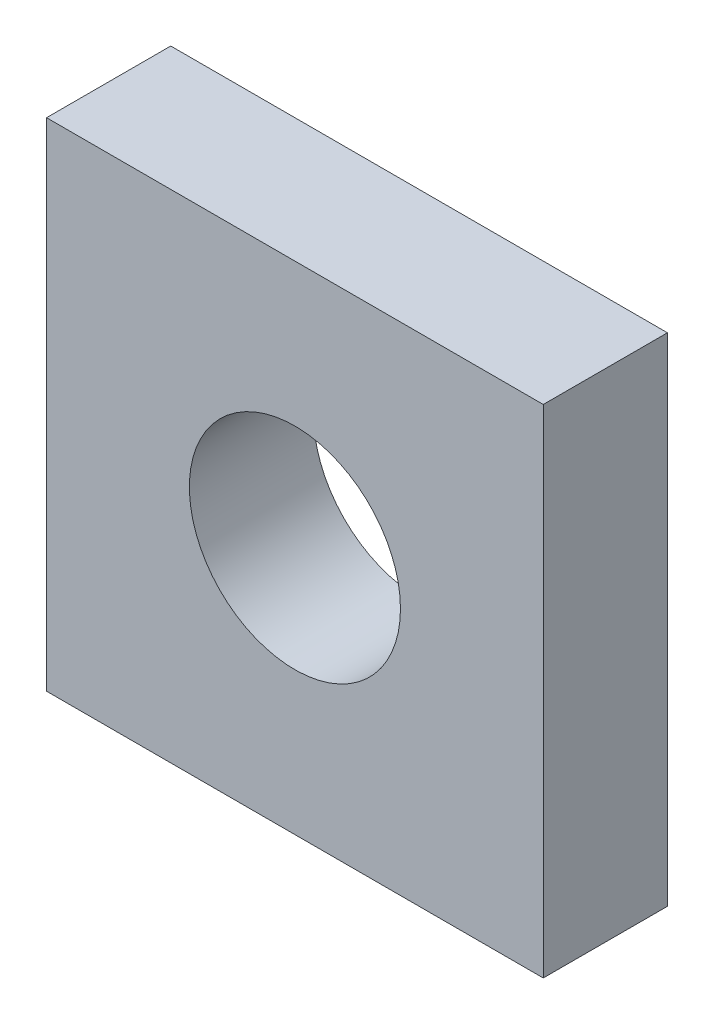
ISO-10303-21;
HEADER;
FILE_DESCRIPTION(('STEP AP214'),'2;1');
FILE_NAME('part.step','',(''),(''),'','','');
FILE_SCHEMA(('AUTOMOTIVE_DESIGN { 1 0 10303 214 1 1 1 1 }'));
ENDSEC;
DATA;
#1=APPLICATION_CONTEXT('core data for automotive mechanical design processes');
#2=APPLICATION_PROTOCOL_DEFINITION('international standard','automotive_design',2000,#1);
#3=PRODUCT_CONTEXT('',#1,'mechanical');
#4=PRODUCT('Part','Part','',(#3));
#5=PRODUCT_RELATED_PRODUCT_CATEGORY('part','',(#4));
#6=PRODUCT_DEFINITION_FORMATION('','',#4);
#7=PRODUCT_DEFINITION_CONTEXT('part definition',#1,'design');
#8=PRODUCT_DEFINITION('design','',#6,#7);
#9=PRODUCT_DEFINITION_SHAPE('','',#8);
#10=(LENGTH_UNIT() NAMED_UNIT(*) SI_UNIT(.MILLI.,.METRE.));
#11=(NAMED_UNIT(*) PLANE_ANGLE_UNIT() SI_UNIT($,.RADIAN.));
#12=(NAMED_UNIT(*) SI_UNIT($,.STERADIAN.) SOLID_ANGLE_UNIT());
#13=UNCERTAINTY_MEASURE_WITH_UNIT(LENGTH_MEASURE(1.E-05),#10,'distance_accuracy_value','');
#14=(GEOMETRIC_REPRESENTATION_CONTEXT(3) GLOBAL_UNCERTAINTY_ASSIGNED_CONTEXT((#13)) GLOBAL_UNIT_ASSIGNED_CONTEXT((#10,
#11,#12)) REPRESENTATION_CONTEXT('',''));
#15=CARTESIAN_POINT('',(0.,0.,0.));
#16=DIRECTION('',(0.,0.,1.));
#17=DIRECTION('',(1.,0.,0.));
#18=AXIS2_PLACEMENT_3D('',#15,#16,#17);
#19=CARTESIAN_POINT('',(78.,-164.,187.4));
#20=DIRECTION('',(0.,0.,1.));
#21=DIRECTION('',(1.,0.,0.));
#22=AXIS2_PLACEMENT_3D('',#19,#20,#21);
#23=CYLINDRICAL_SURFACE('',#22,1.7);
#24=DIRECTION('',(0.,0.,1.));
#25=VECTOR('',#24,1.);
#26=CARTESIAN_POINT('',(79.7,-164.,187.4));
#27=LINE('',#26,#25);
#28=CARTESIAN_POINT('',(79.7,-164.,187.5));
#29=VERTEX_POINT('',#28);
#30=CARTESIAN_POINT('',(79.7,-164.,189.5));
#31=VERTEX_POINT('',#30);
#32=EDGE_CURVE('E9',#29,#31,#27,.T.);
#33=ORIENTED_EDGE('',*,*,#32,.F.);
#34=CARTESIAN_POINT('',(78.,-164.,187.5));
#35=DIRECTION('',(0.,0.,1.));
#36=DIRECTION('',(1.,0.,0.));
#37=AXIS2_PLACEMENT_3D('',#34,#35,#36);
#38=CIRCLE('',#37,1.7);
#39=EDGE_CURVE('E25',#29,#29,#38,.T.);
#40=ORIENTED_EDGE('',*,*,#39,.F.);
#41=ORIENTED_EDGE('',*,*,#32,.T.);
#42=CARTESIAN_POINT('',(78.,-164.,189.5));
#43=DIRECTION('',(0.,0.,1.));
#44=DIRECTION('',(1.,0.,0.));
#45=AXIS2_PLACEMENT_3D('',#42,#43,#44);
#46=CIRCLE('',#45,1.7);
#47=EDGE_CURVE('E104',#31,#31,#46,.T.);
#48=ORIENTED_EDGE('',*,*,#47,.T.);
#49=EDGE_LOOP('',(#33,#40,#41,#48));
#50=FACE_BOUND('',#49,.T.);
#51=ADVANCED_FACE('F14',(#50),#23,.F.);
#52=CARTESIAN_POINT('',(82.,-168.,187.5));
#53=DIRECTION('',(1.,0.,0.));
#54=DIRECTION('',(0.,1.,0.));
#55=AXIS2_PLACEMENT_3D('',#52,#53,#54);
#56=PLANE('',#55);
#57=DIRECTION('',(0.,0.,1.));
#58=VECTOR('',#57,1.);
#59=CARTESIAN_POINT('',(82.,-168.,187.5));
#60=LINE('',#59,#58);
#61=CARTESIAN_POINT('',(82.,-168.,187.5));
#62=VERTEX_POINT('',#61);
#63=CARTESIAN_POINT('',(82.,-168.,189.5));
#64=VERTEX_POINT('',#63);
#65=EDGE_CURVE('E121',#62,#64,#60,.T.);
#66=ORIENTED_EDGE('',*,*,#65,.F.);
#67=DIRECTION('',(0.,1.,0.));
#68=VECTOR('',#67,1.);
#69=CARTESIAN_POINT('',(82.,-168.,187.5));
#70=LINE('',#69,#68);
#71=CARTESIAN_POINT('',(82.,-160.,187.5));
#72=VERTEX_POINT('',#71);
#73=EDGE_CURVE('E96',#62,#72,#70,.T.);
#74=ORIENTED_EDGE('',*,*,#73,.T.);
#75=DIRECTION('',(0.,0.,1.));
#76=VECTOR('',#75,1.);
#77=CARTESIAN_POINT('',(82.,-160.,187.5));
#78=LINE('',#77,#76);
#79=CARTESIAN_POINT('',(82.,-160.,189.5));
#80=VERTEX_POINT('',#79);
#81=EDGE_CURVE('E94',#72,#80,#78,.T.);
#82=ORIENTED_EDGE('',*,*,#81,.T.);
#83=DIRECTION('',(0.,1.,0.));
#84=VECTOR('',#83,1.);
#85=CARTESIAN_POINT('',(82.,-168.,189.5));
#86=LINE('',#85,#84);
#87=EDGE_CURVE('E91',#64,#80,#86,.T.);
#88=ORIENTED_EDGE('',*,*,#87,.F.);
#89=EDGE_LOOP('',(#66,#74,#82,#88));
#90=FACE_BOUND('',#89,.T.);
#91=ADVANCED_FACE('F95',(#90),#56,.T.);
#92=CARTESIAN_POINT('',(74.,-168.,187.5));
#93=DIRECTION('',(0.,0.,1.));
#94=DIRECTION('',(1.,0.,0.));
#95=AXIS2_PLACEMENT_3D('',#92,#93,#94);
#96=PLANE('',#95);
#97=ORIENTED_EDGE('',*,*,#39,.T.);
#98=EDGE_LOOP('',(#97));
#99=FACE_BOUND('',#98,.T.);
#100=DIRECTION('',(1.,0.,0.));
#101=VECTOR('',#100,1.);
#102=CARTESIAN_POINT('',(74.,-160.,187.5));
#103=LINE('',#102,#101);
#104=CARTESIAN_POINT('',(74.,-160.,187.5));
#105=VERTEX_POINT('',#104);
#106=EDGE_CURVE('E74',#105,#72,#103,.T.);
#107=ORIENTED_EDGE('',*,*,#106,.T.);
#108=ORIENTED_EDGE('',*,*,#73,.F.);
#109=DIRECTION('',(1.,0.,0.));
#110=VECTOR('',#109,1.);
#111=CARTESIAN_POINT('',(74.,-168.,187.5));
#112=LINE('',#111,#110);
#113=CARTESIAN_POINT('',(74.,-168.,187.5));
#114=VERTEX_POINT('',#113);
#115=EDGE_CURVE('E84',#114,#62,#112,.T.);
#116=ORIENTED_EDGE('',*,*,#115,.F.);
#117=DIRECTION('',(0.,1.,0.));
#118=VECTOR('',#117,1.);
#119=CARTESIAN_POINT('',(74.,-168.,187.5));
#120=LINE('',#119,#118);
#121=EDGE_CURVE('E116',#114,#105,#120,.T.);
#122=ORIENTED_EDGE('',*,*,#121,.T.);
#123=EDGE_LOOP('',(#107,#108,#116,#122));
#124=FACE_BOUND('',#123,.T.);
#125=ADVANCED_FACE('F141',(#99,#124),#96,.F.);
#126=CARTESIAN_POINT('',(74.,-160.,187.5));
#127=DIRECTION('',(0.,1.,0.));
#128=DIRECTION('',(1.,0.,0.));
#129=AXIS2_PLACEMENT_3D('',#126,#127,#128);
#130=PLANE('',#129);
#131=ORIENTED_EDGE('',*,*,#106,.F.);
#132=DIRECTION('',(0.,0.,1.));
#133=VECTOR('',#132,1.);
#134=CARTESIAN_POINT('',(74.,-160.,187.5));
#135=LINE('',#134,#133);
#136=CARTESIAN_POINT('',(74.,-160.,189.5));
#137=VERTEX_POINT('',#136);
#138=EDGE_CURVE('E101',#105,#137,#135,.T.);
#139=ORIENTED_EDGE('',*,*,#138,.T.);
#140=DIRECTION('',(1.,0.,0.));
#141=VECTOR('',#140,1.);
#142=CARTESIAN_POINT('',(74.,-160.,189.5));
#143=LINE('',#142,#141);
#144=EDGE_CURVE('E66',#137,#80,#143,.T.);
#145=ORIENTED_EDGE('',*,*,#144,.T.);
#146=ORIENTED_EDGE('',*,*,#81,.F.);
#147=EDGE_LOOP('',(#131,#139,#145,#146));
#148=FACE_BOUND('',#147,.T.);
#149=ADVANCED_FACE('F99',(#148),#130,.T.);
#150=CARTESIAN_POINT('',(74.,-168.,189.5));
#151=DIRECTION('',(0.,0.,1.));
#152=DIRECTION('',(1.,0.,0.));
#153=AXIS2_PLACEMENT_3D('',#150,#151,#152);
#154=PLANE('',#153);
#155=ORIENTED_EDGE('',*,*,#47,.F.);
#156=EDGE_LOOP('',(#155));
#157=FACE_BOUND('',#156,.T.);
#158=DIRECTION('',(0.,1.,0.));
#159=VECTOR('',#158,1.);
#160=CARTESIAN_POINT('',(74.,-168.,189.5));
#161=LINE('',#160,#159);
#162=CARTESIAN_POINT('',(74.,-168.,189.5));
#163=VERTEX_POINT('',#162);
#164=EDGE_CURVE('E117',#163,#137,#161,.T.);
#165=ORIENTED_EDGE('',*,*,#164,.F.);
#166=DIRECTION('',(1.,0.,0.));
#167=VECTOR('',#166,1.);
#168=CARTESIAN_POINT('',(74.,-168.,189.5));
#169=LINE('',#168,#167);
#170=EDGE_CURVE('E18',#163,#64,#169,.T.);
#171=ORIENTED_EDGE('',*,*,#170,.T.);
#172=ORIENTED_EDGE('',*,*,#87,.T.);
#173=ORIENTED_EDGE('',*,*,#144,.F.);
#174=EDGE_LOOP('',(#165,#171,#172,#173));
#175=FACE_BOUND('',#174,.T.);
#176=ADVANCED_FACE('F16',(#157,#175),#154,.T.);
#177=CARTESIAN_POINT('',(74.,-168.,187.5));
#178=DIRECTION('',(0.,1.,0.));
#179=DIRECTION('',(1.,0.,0.));
#180=AXIS2_PLACEMENT_3D('',#177,#178,#179);
#181=PLANE('',#180);
#182=ORIENTED_EDGE('',*,*,#65,.T.);
#183=ORIENTED_EDGE('',*,*,#170,.F.);
#184=DIRECTION('',(0.,0.,1.));
#185=VECTOR('',#184,1.);
#186=CARTESIAN_POINT('',(74.,-168.,187.5));
#187=LINE('',#186,#185);
#188=EDGE_CURVE('E118',#114,#163,#187,.T.);
#189=ORIENTED_EDGE('',*,*,#188,.F.);
#190=ORIENTED_EDGE('',*,*,#115,.T.);
#191=EDGE_LOOP('',(#182,#183,#189,#190));
#192=FACE_BOUND('',#191,.T.);
#193=ADVANCED_FACE('F145',(#192),#181,.F.);
#194=CARTESIAN_POINT('',(74.,-168.,187.5));
#195=DIRECTION('',(1.,0.,0.));
#196=DIRECTION('',(0.,1.,0.));
#197=AXIS2_PLACEMENT_3D('',#194,#195,#196);
#198=PLANE('',#197);
#199=ORIENTED_EDGE('',*,*,#164,.T.);
#200=ORIENTED_EDGE('',*,*,#138,.F.);
#201=ORIENTED_EDGE('',*,*,#121,.F.);
#202=ORIENTED_EDGE('',*,*,#188,.T.);
#203=EDGE_LOOP('',(#199,#200,#201,#202));
#204=FACE_BOUND('',#203,.T.);
#205=ADVANCED_FACE('F151',(#204),#198,.F.);
#206=CLOSED_SHELL('',(#51,#91,#125,#149,#176,#193,#205));
#207=MANIFOLD_SOLID_BREP('B1',#206);
#208=ADVANCED_BREP_SHAPE_REPRESENTATION('',(#18,#207),#14);
#209=SHAPE_DEFINITION_REPRESENTATION(#9,#208);
ENDSEC;
END-ISO-10303-21;
